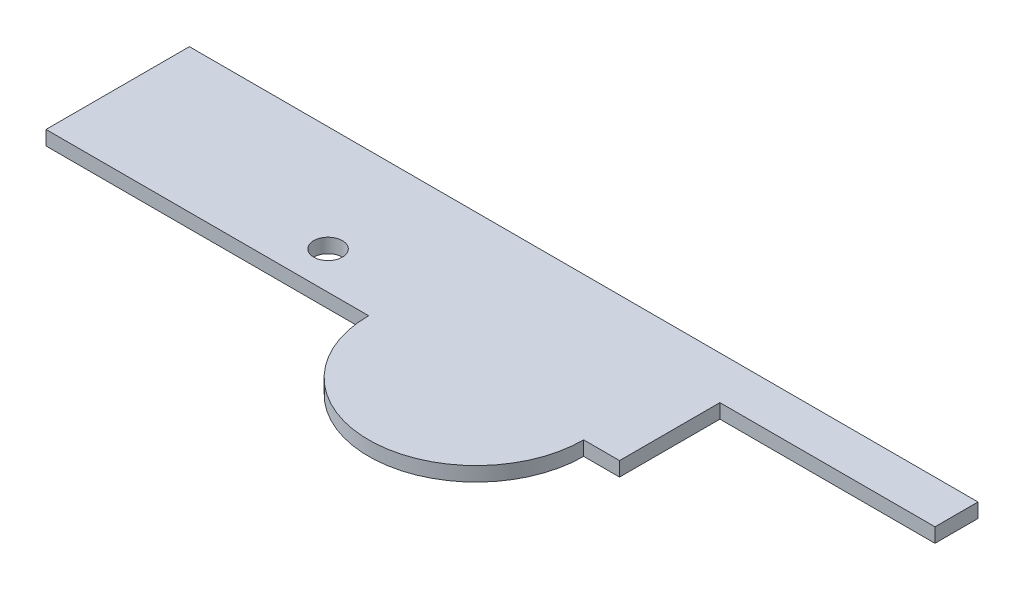
ISO-10303-21;
HEADER;
FILE_DESCRIPTION(('STEP AP214'),'2;1');
FILE_NAME('part.step','',(''),(''),'','','');
FILE_SCHEMA(('AUTOMOTIVE_DESIGN { 1 0 10303 214 1 1 1 1 }'));
ENDSEC;
DATA;
#1=APPLICATION_CONTEXT('core data for automotive mechanical design processes');
#2=APPLICATION_PROTOCOL_DEFINITION('international standard','automotive_design',2000,#1);
#3=PRODUCT_CONTEXT('',#1,'mechanical');
#4=PRODUCT('Part','Part','',(#3));
#5=PRODUCT_RELATED_PRODUCT_CATEGORY('part','',(#4));
#6=PRODUCT_DEFINITION_FORMATION('','',#4);
#7=PRODUCT_DEFINITION_CONTEXT('part definition',#1,'design');
#8=PRODUCT_DEFINITION('design','',#6,#7);
#9=PRODUCT_DEFINITION_SHAPE('','',#8);
#10=(LENGTH_UNIT() NAMED_UNIT(*) SI_UNIT(.MILLI.,.METRE.));
#11=(NAMED_UNIT(*) PLANE_ANGLE_UNIT() SI_UNIT($,.RADIAN.));
#12=(NAMED_UNIT(*) SI_UNIT($,.STERADIAN.) SOLID_ANGLE_UNIT());
#13=UNCERTAINTY_MEASURE_WITH_UNIT(LENGTH_MEASURE(1.E-05),#10,'distance_accuracy_value','');
#14=(GEOMETRIC_REPRESENTATION_CONTEXT(3) GLOBAL_UNCERTAINTY_ASSIGNED_CONTEXT((#13)) GLOBAL_UNIT_ASSIGNED_CONTEXT((#10,
#11,#12)) REPRESENTATION_CONTEXT('',''));
#15=CARTESIAN_POINT('',(0.,0.,0.));
#16=DIRECTION('',(0.,0.,1.));
#17=DIRECTION('',(1.,0.,0.));
#18=AXIS2_PLACEMENT_3D('',#15,#16,#17);
#19=CARTESIAN_POINT('',(41.5322580645161,1.,-5.));
#20=DIRECTION('',(-1.,0.,0.));
#21=DIRECTION('',(0.,0.,1.));
#22=AXIS2_PLACEMENT_3D('',#19,#20,#21);
#23=PLANE('',#22);
#24=DIRECTION('',(0.,0.,-1.));
#25=VECTOR('',#24,1.);
#26=CARTESIAN_POINT('',(41.5322580645161,0.,-5.));
#27=LINE('',#26,#25);
#28=CARTESIAN_POINT('',(41.5322580645161,0.,-2.));
#29=VERTEX_POINT('',#28);
#30=CARTESIAN_POINT('',(41.5322580645161,0.,-5.));
#31=VERTEX_POINT('',#30);
#32=EDGE_CURVE('E128',#29,#31,#27,.T.);
#33=ORIENTED_EDGE('',*,*,#32,.T.);
#34=DIRECTION('',(0.,-1.,0.));
#35=VECTOR('',#34,1.);
#36=CARTESIAN_POINT('',(41.5322580645161,1.,-5.));
#37=LINE('',#36,#35);
#38=CARTESIAN_POINT('',(41.5322580645161,1.,-5.));
#39=VERTEX_POINT('',#38);
#40=EDGE_CURVE('E11',#39,#31,#37,.T.);
#41=ORIENTED_EDGE('',*,*,#40,.F.);
#42=DIRECTION('',(0.,0.,-1.));
#43=VECTOR('',#42,1.);
#44=CARTESIAN_POINT('',(41.5322580645161,1.,-5.));
#45=LINE('',#44,#43);
#46=CARTESIAN_POINT('',(41.5322580645161,1.,-2.));
#47=VERTEX_POINT('',#46);
#48=EDGE_CURVE('E143',#47,#39,#45,.T.);
#49=ORIENTED_EDGE('',*,*,#48,.F.);
#50=DIRECTION('',(0.,-1.,0.));
#51=VECTOR('',#50,1.);
#52=CARTESIAN_POINT('',(41.5322580645161,1.,-2.));
#53=LINE('',#52,#51);
#54=EDGE_CURVE('E124',#47,#29,#53,.T.);
#55=ORIENTED_EDGE('',*,*,#54,.T.);
#56=EDGE_LOOP('',(#33,#41,#49,#55));
#57=FACE_BOUND('',#56,.T.);
#58=ADVANCED_FACE('F32',(#57),#23,.F.);
#59=CARTESIAN_POINT('',(-13.4677419354839,1.,-5.));
#60=DIRECTION('',(0.,0.,1.));
#61=DIRECTION('',(1.,0.,0.));
#62=AXIS2_PLACEMENT_3D('',#59,#60,#61);
#63=PLANE('',#62);
#64=DIRECTION('',(-1.,0.,0.));
#65=VECTOR('',#64,1.);
#66=CARTESIAN_POINT('',(-13.4677419354839,0.,-5.));
#67=LINE('',#66,#65);
#68=CARTESIAN_POINT('',(-13.4677419354839,0.,-5.));
#69=VERTEX_POINT('',#68);
#70=EDGE_CURVE('E131',#31,#69,#67,.T.);
#71=ORIENTED_EDGE('',*,*,#70,.T.);
#72=DIRECTION('',(0.,-1.,0.));
#73=VECTOR('',#72,1.);
#74=CARTESIAN_POINT('',(-13.4677419354839,1.,-5.));
#75=LINE('',#74,#73);
#76=CARTESIAN_POINT('',(-13.4677419354839,1.,-5.));
#77=VERTEX_POINT('',#76);
#78=EDGE_CURVE('E40',#77,#69,#75,.T.);
#79=ORIENTED_EDGE('',*,*,#78,.F.);
#80=DIRECTION('',(-1.,0.,0.));
#81=VECTOR('',#80,1.);
#82=CARTESIAN_POINT('',(26.5322580645161,1.,-5.));
#83=LINE('',#82,#81);
#84=EDGE_CURVE('E91',#39,#77,#83,.T.);
#85=ORIENTED_EDGE('',*,*,#84,.F.);
#86=ORIENTED_EDGE('',*,*,#40,.T.);
#87=EDGE_LOOP('',(#71,#79,#85,#86));
#88=FACE_BOUND('',#87,.T.);
#89=ADVANCED_FACE('F197',(#88),#63,.F.);
#90=CARTESIAN_POINT('',(-13.4677419354839,1.,5.));
#91=DIRECTION('',(1.,0.,0.));
#92=DIRECTION('',(0.,0.,-1.));
#93=AXIS2_PLACEMENT_3D('',#90,#91,#92);
#94=PLANE('',#93);
#95=DIRECTION('',(0.,0.,1.));
#96=VECTOR('',#95,1.);
#97=CARTESIAN_POINT('',(-13.4677419354839,0.,5.));
#98=LINE('',#97,#96);
#99=CARTESIAN_POINT('',(-13.4677419354839,0.,5.));
#100=VERTEX_POINT('',#99);
#101=EDGE_CURVE('E134',#69,#100,#98,.T.);
#102=ORIENTED_EDGE('',*,*,#101,.T.);
#103=DIRECTION('',(0.,-1.,0.));
#104=VECTOR('',#103,1.);
#105=CARTESIAN_POINT('',(-13.4677419354839,1.,5.));
#106=LINE('',#105,#104);
#107=CARTESIAN_POINT('',(-13.4677419354839,1.,5.));
#108=VERTEX_POINT('',#107);
#109=EDGE_CURVE('E150',#108,#100,#106,.T.);
#110=ORIENTED_EDGE('',*,*,#109,.F.);
#111=DIRECTION('',(0.,0.,1.));
#112=VECTOR('',#111,1.);
#113=CARTESIAN_POINT('',(-13.4677419354839,1.,5.));
#114=LINE('',#113,#112);
#115=EDGE_CURVE('E158',#77,#108,#114,.T.);
#116=ORIENTED_EDGE('',*,*,#115,.F.);
#117=ORIENTED_EDGE('',*,*,#78,.T.);
#118=EDGE_LOOP('',(#102,#110,#116,#117));
#119=FACE_BOUND('',#118,.T.);
#120=ADVANCED_FACE('F156',(#119),#94,.F.);
#121=CARTESIAN_POINT('',(9.03225806451614,1.,5.));
#122=DIRECTION('',(0.,0.,-1.));
#123=DIRECTION('',(-1.,0.,0.));
#124=AXIS2_PLACEMENT_3D('',#121,#122,#123);
#125=PLANE('',#124);
#126=DIRECTION('',(1.,0.,0.));
#127=VECTOR('',#126,1.);
#128=CARTESIAN_POINT('',(9.03225806451614,0.,5.));
#129=LINE('',#128,#127);
#130=CARTESIAN_POINT('',(9.03225806451614,0.,5.));
#131=VERTEX_POINT('',#130);
#132=EDGE_CURVE('E136',#100,#131,#129,.T.);
#133=ORIENTED_EDGE('',*,*,#132,.T.);
#134=DIRECTION('',(0.,-1.,0.));
#135=VECTOR('',#134,1.);
#136=CARTESIAN_POINT('',(9.03225806451614,1.,5.));
#137=LINE('',#136,#135);
#138=CARTESIAN_POINT('',(9.03225806451614,1.,5.));
#139=VERTEX_POINT('',#138);
#140=EDGE_CURVE('E147',#139,#131,#137,.T.);
#141=ORIENTED_EDGE('',*,*,#140,.F.);
#142=DIRECTION('',(1.,0.,0.));
#143=VECTOR('',#142,1.);
#144=CARTESIAN_POINT('',(9.03225806451614,1.,5.));
#145=LINE('',#144,#143);
#146=EDGE_CURVE('E170',#108,#139,#145,.T.);
#147=ORIENTED_EDGE('',*,*,#146,.F.);
#148=ORIENTED_EDGE('',*,*,#109,.T.);
#149=EDGE_LOOP('',(#133,#141,#147,#148));
#150=FACE_BOUND('',#149,.T.);
#151=ADVANCED_FACE('F166',(#150),#125,.F.);
#152=CARTESIAN_POINT('',(16.5322580645161,1.,5.));
#153=DIRECTION('',(0.,-1.,0.));
#154=DIRECTION('',(0.,0.,-1.));
#155=AXIS2_PLACEMENT_3D('',#152,#153,#154);
#156=CYLINDRICAL_SURFACE('',#155,7.5);
#157=CARTESIAN_POINT('',(16.5322580645161,0.,5.));
#158=DIRECTION('',(0.,1.,0.));
#159=DIRECTION('',(0.,0.,1.));
#160=AXIS2_PLACEMENT_3D('',#157,#158,#159);
#161=CIRCLE('',#160,7.5);
#162=CARTESIAN_POINT('',(24.0322580645161,0.,5.));
#163=VERTEX_POINT('',#162);
#164=EDGE_CURVE('E138',#131,#163,#161,.T.);
#165=ORIENTED_EDGE('',*,*,#164,.T.);
#166=DIRECTION('',(0.,-1.,0.));
#167=VECTOR('',#166,1.);
#168=CARTESIAN_POINT('',(24.0322580645161,1.,5.));
#169=LINE('',#168,#167);
#170=CARTESIAN_POINT('',(24.0322580645161,1.,5.));
#171=VERTEX_POINT('',#170);
#172=EDGE_CURVE('E119',#171,#163,#169,.T.);
#173=ORIENTED_EDGE('',*,*,#172,.F.);
#174=CARTESIAN_POINT('',(16.5322580645161,1.,5.));
#175=DIRECTION('',(0.,1.,0.));
#176=DIRECTION('',(0.,0.,1.));
#177=AXIS2_PLACEMENT_3D('',#174,#175,#176);
#178=CIRCLE('',#177,7.5);
#179=EDGE_CURVE('E110',#139,#171,#178,.T.);
#180=ORIENTED_EDGE('',*,*,#179,.F.);
#181=ORIENTED_EDGE('',*,*,#140,.T.);
#182=EDGE_LOOP('',(#165,#173,#180,#181));
#183=FACE_BOUND('',#182,.T.);
#184=ADVANCED_FACE('F169',(#183),#156,.T.);
#185=CARTESIAN_POINT('',(24.0322580645161,1.,5.));
#186=DIRECTION('',(0.,0.,-1.));
#187=DIRECTION('',(-1.,0.,0.));
#188=AXIS2_PLACEMENT_3D('',#185,#186,#187);
#189=PLANE('',#188);
#190=DIRECTION('',(1.,0.,0.));
#191=VECTOR('',#190,1.);
#192=CARTESIAN_POINT('',(24.0322580645161,0.,5.));
#193=LINE('',#192,#191);
#194=CARTESIAN_POINT('',(26.5322580645161,0.,5.));
#195=VERTEX_POINT('',#194);
#196=EDGE_CURVE('E118',#163,#195,#193,.T.);
#197=ORIENTED_EDGE('',*,*,#196,.T.);
#198=DIRECTION('',(0.,-1.,0.));
#199=VECTOR('',#198,1.);
#200=CARTESIAN_POINT('',(26.5322580645161,1.,5.));
#201=LINE('',#200,#199);
#202=CARTESIAN_POINT('',(26.5322580645161,1.,5.));
#203=VERTEX_POINT('',#202);
#204=EDGE_CURVE('E115',#203,#195,#201,.T.);
#205=ORIENTED_EDGE('',*,*,#204,.F.);
#206=DIRECTION('',(1.,0.,0.));
#207=VECTOR('',#206,1.);
#208=CARTESIAN_POINT('',(24.0322580645161,1.,5.));
#209=LINE('',#208,#207);
#210=EDGE_CURVE('E104',#171,#203,#209,.T.);
#211=ORIENTED_EDGE('',*,*,#210,.F.);
#212=ORIENTED_EDGE('',*,*,#172,.T.);
#213=EDGE_LOOP('',(#197,#205,#211,#212));
#214=FACE_BOUND('',#213,.T.);
#215=ADVANCED_FACE('F116',(#214),#189,.F.);
#216=CARTESIAN_POINT('',(26.5322580645161,1.,5.));
#217=DIRECTION('',(-1.,0.,0.));
#218=DIRECTION('',(0.,0.,1.));
#219=AXIS2_PLACEMENT_3D('',#216,#217,#218);
#220=PLANE('',#219);
#221=DIRECTION('',(0.,0.,-1.));
#222=VECTOR('',#221,1.);
#223=CARTESIAN_POINT('',(26.5322580645161,0.,5.));
#224=LINE('',#223,#222);
#225=CARTESIAN_POINT('',(26.5322580645161,0.,-2.));
#226=VERTEX_POINT('',#225);
#227=EDGE_CURVE('E77',#195,#226,#224,.T.);
#228=ORIENTED_EDGE('',*,*,#227,.T.);
#229=DIRECTION('',(0.,-1.,0.));
#230=VECTOR('',#229,1.);
#231=CARTESIAN_POINT('',(26.5322580645161,1.,-2.));
#232=LINE('',#231,#230);
#233=CARTESIAN_POINT('',(26.5322580645161,1.,-2.));
#234=VERTEX_POINT('',#233);
#235=EDGE_CURVE('E120',#234,#226,#232,.T.);
#236=ORIENTED_EDGE('',*,*,#235,.F.);
#237=DIRECTION('',(0.,0.,-1.));
#238=VECTOR('',#237,1.);
#239=CARTESIAN_POINT('',(26.5322580645161,1.,5.));
#240=LINE('',#239,#238);
#241=EDGE_CURVE('E108',#203,#234,#240,.T.);
#242=ORIENTED_EDGE('',*,*,#241,.F.);
#243=ORIENTED_EDGE('',*,*,#204,.T.);
#244=EDGE_LOOP('',(#228,#236,#242,#243));
#245=FACE_BOUND('',#244,.T.);
#246=ADVANCED_FACE('F122',(#245),#220,.F.);
#247=CARTESIAN_POINT('',(41.5322580645161,1.,-2.));
#248=DIRECTION('',(0.,0.,-1.));
#249=DIRECTION('',(-1.,0.,0.));
#250=AXIS2_PLACEMENT_3D('',#247,#248,#249);
#251=PLANE('',#250);
#252=DIRECTION('',(1.,0.,0.));
#253=VECTOR('',#252,1.);
#254=CARTESIAN_POINT('',(41.5322580645161,0.,-2.));
#255=LINE('',#254,#253);
#256=EDGE_CURVE('E83',#226,#29,#255,.T.);
#257=ORIENTED_EDGE('',*,*,#256,.T.);
#258=ORIENTED_EDGE('',*,*,#54,.F.);
#259=DIRECTION('',(1.,0.,0.));
#260=VECTOR('',#259,1.);
#261=CARTESIAN_POINT('',(41.5322580645161,1.,-2.));
#262=LINE('',#261,#260);
#263=EDGE_CURVE('E48',#234,#47,#262,.T.);
#264=ORIENTED_EDGE('',*,*,#263,.F.);
#265=ORIENTED_EDGE('',*,*,#235,.T.);
#266=EDGE_LOOP('',(#257,#258,#264,#265));
#267=FACE_BOUND('',#266,.T.);
#268=ADVANCED_FACE('F192',(#267),#251,.F.);
#269=CARTESIAN_POINT('',(16.5322580645161,1.,5.));
#270=DIRECTION('',(0.,1.,0.));
#271=DIRECTION('',(0.,0.,1.));
#272=AXIS2_PLACEMENT_3D('',#269,#270,#271);
#273=PLANE('',#272);
#274=CARTESIAN_POINT('',(3.58225806451614,0.999999999999999,2.38));
#275=DIRECTION('',(0.,1.,0.));
#276=DIRECTION('',(0.,0.,1.));
#277=AXIS2_PLACEMENT_3D('',#274,#275,#276);
#278=CIRCLE('',#277,1.);
#279=CARTESIAN_POINT('',(3.58225806451614,0.999999999999999,3.38));
#280=VERTEX_POINT('',#279);
#281=EDGE_CURVE('E132',#280,#280,#278,.T.);
#282=ORIENTED_EDGE('',*,*,#281,.F.);
#283=EDGE_LOOP('',(#282));
#284=FACE_BOUND('',#283,.T.);
#285=ORIENTED_EDGE('',*,*,#48,.T.);
#286=ORIENTED_EDGE('',*,*,#84,.T.);
#287=ORIENTED_EDGE('',*,*,#115,.T.);
#288=ORIENTED_EDGE('',*,*,#146,.T.);
#289=ORIENTED_EDGE('',*,*,#179,.T.);
#290=ORIENTED_EDGE('',*,*,#210,.T.);
#291=ORIENTED_EDGE('',*,*,#241,.T.);
#292=ORIENTED_EDGE('',*,*,#263,.T.);
#293=EDGE_LOOP('',(#285,#286,#287,#288,#289,#290,#291,#292));
#294=FACE_BOUND('',#293,.T.);
#295=ADVANCED_FACE('F106',(#284,#294),#273,.T.);
#296=CARTESIAN_POINT('',(16.5322580645161,0.,5.));
#297=DIRECTION('',(0.,1.,0.));
#298=DIRECTION('',(0.,0.,1.));
#299=AXIS2_PLACEMENT_3D('',#296,#297,#298);
#300=PLANE('',#299);
#301=CARTESIAN_POINT('',(3.58225806451614,0.,2.38));
#302=DIRECTION('',(0.,-1.,0.));
#303=DIRECTION('',(0.,0.,-1.));
#304=AXIS2_PLACEMENT_3D('',#301,#302,#303);
#305=CIRCLE('',#304,1.);
#306=CARTESIAN_POINT('',(3.58225806451614,0.,1.38));
#307=VERTEX_POINT('',#306);
#308=EDGE_CURVE('E178',#307,#307,#305,.T.);
#309=ORIENTED_EDGE('',*,*,#308,.F.);
#310=EDGE_LOOP('',(#309));
#311=FACE_BOUND('',#310,.T.);
#312=ORIENTED_EDGE('',*,*,#32,.F.);
#313=ORIENTED_EDGE('',*,*,#256,.F.);
#314=ORIENTED_EDGE('',*,*,#227,.F.);
#315=ORIENTED_EDGE('',*,*,#196,.F.);
#316=ORIENTED_EDGE('',*,*,#164,.F.);
#317=ORIENTED_EDGE('',*,*,#132,.F.);
#318=ORIENTED_EDGE('',*,*,#101,.F.);
#319=ORIENTED_EDGE('',*,*,#70,.F.);
#320=EDGE_LOOP('',(#312,#313,#314,#315,#316,#317,#318,#319));
#321=FACE_BOUND('',#320,.T.);
#322=ADVANCED_FACE('F162',(#311,#321),#300,.F.);
#323=CARTESIAN_POINT('',(3.58225806451614,10.,2.38));
#324=DIRECTION('',(0.,-1.,0.));
#325=DIRECTION('',(0.,0.,-1.));
#326=AXIS2_PLACEMENT_3D('',#323,#324,#325);
#327=CYLINDRICAL_SURFACE('',#326,1.);
#328=ORIENTED_EDGE('',*,*,#281,.T.);
#329=EDGE_LOOP('',(#328));
#330=FACE_BOUND('',#329,.T.);
#331=ORIENTED_EDGE('',*,*,#308,.T.);
#332=EDGE_LOOP('',(#331));
#333=FACE_BOUND('',#332,.T.);
#334=ADVANCED_FACE('F182',(#330,#333),#327,.F.);
#335=CLOSED_SHELL('',(#58,#89,#120,#151,#184,#215,#246,#268,#295,#322,#334));
#336=MANIFOLD_SOLID_BREP('B2',#335);
#337=ADVANCED_BREP_SHAPE_REPRESENTATION('',(#18,#336),#14);
#338=SHAPE_DEFINITION_REPRESENTATION(#9,#337);
ENDSEC;
END-ISO-10303-21;
